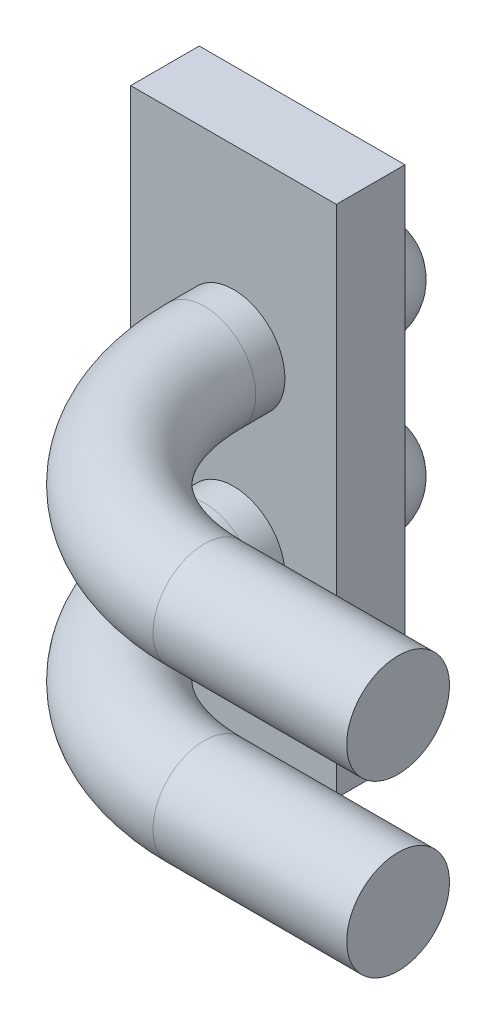
ISO-10303-21;
HEADER;
FILE_DESCRIPTION(('STEP AP214'),'2;1');
FILE_NAME('part.step','',(''),(''),'','','');
FILE_SCHEMA(('AUTOMOTIVE_DESIGN { 1 0 10303 214 1 1 1 1 }'));
ENDSEC;
DATA;
#1=APPLICATION_CONTEXT('core data for automotive mechanical design processes');
#2=APPLICATION_PROTOCOL_DEFINITION('international standard','automotive_design',2000,#1);
#3=PRODUCT_CONTEXT('',#1,'mechanical');
#4=PRODUCT('Part','Part','',(#3));
#5=PRODUCT_RELATED_PRODUCT_CATEGORY('part','',(#4));
#6=PRODUCT_DEFINITION_FORMATION('','',#4);
#7=PRODUCT_DEFINITION_CONTEXT('part definition',#1,'design');
#8=PRODUCT_DEFINITION('design','',#6,#7);
#9=PRODUCT_DEFINITION_SHAPE('','',#8);
#10=(LENGTH_UNIT() NAMED_UNIT(*) SI_UNIT(.MILLI.,.METRE.));
#11=(NAMED_UNIT(*) PLANE_ANGLE_UNIT() SI_UNIT($,.RADIAN.));
#12=(NAMED_UNIT(*) SI_UNIT($,.STERADIAN.) SOLID_ANGLE_UNIT());
#13=UNCERTAINTY_MEASURE_WITH_UNIT(LENGTH_MEASURE(1.E-05),#10,'distance_accuracy_value','');
#14=(GEOMETRIC_REPRESENTATION_CONTEXT(3) GLOBAL_UNCERTAINTY_ASSIGNED_CONTEXT((#13)) GLOBAL_UNIT_ASSIGNED_CONTEXT((#10,
#11,#12)) REPRESENTATION_CONTEXT('',''));
#15=CARTESIAN_POINT('',(0.,0.,0.));
#16=DIRECTION('',(0.,0.,1.));
#17=DIRECTION('',(1.,0.,0.));
#18=AXIS2_PLACEMENT_3D('',#15,#16,#17);
#19=CARTESIAN_POINT('',(3.00000000000001,7.5,2.));
#20=DIRECTION('',(0.,0.,-1.));
#21=DIRECTION('',(-1.,0.,0.));
#22=AXIS2_PLACEMENT_3D('',#19,#20,#21);
#23=PLANE('',#22);
#24=CARTESIAN_POINT('',(0.,-2.62,2.));
#25=DIRECTION('',(0.,0.,1.));
#26=DIRECTION('',(1.,0.,0.));
#27=AXIS2_PLACEMENT_3D('',#24,#25,#26);
#28=CIRCLE('',#27,1.5);
#29=CARTESIAN_POINT('',(1.5,-2.62,2.));
#30=VERTEX_POINT('',#29);
#31=EDGE_CURVE('E42',#30,#30,#28,.T.);
#32=ORIENTED_EDGE('',*,*,#31,.F.);
#33=EDGE_LOOP('',(#32));
#34=FACE_BOUND('',#33,.T.);
#35=DIRECTION('',(0.,1.,0.));
#36=VECTOR('',#35,1.);
#37=CARTESIAN_POINT('',(3.00000000000001,-7.5,2.));
#38=LINE('',#37,#36);
#39=CARTESIAN_POINT('',(3.00000000000001,-7.5,2.));
#40=VERTEX_POINT('',#39);
#41=CARTESIAN_POINT('',(3.00000000000001,7.5,2.));
#42=VERTEX_POINT('',#41);
#43=EDGE_CURVE('E87',#40,#42,#38,.T.);
#44=ORIENTED_EDGE('',*,*,#43,.T.);
#45=DIRECTION('',(-1.,0.,0.));
#46=VECTOR('',#45,1.);
#47=CARTESIAN_POINT('',(-3.,7.5,2.));
#48=LINE('',#47,#46);
#49=CARTESIAN_POINT('',(-3.,7.5,2.));
#50=VERTEX_POINT('',#49);
#51=EDGE_CURVE('E82',#42,#50,#48,.T.);
#52=ORIENTED_EDGE('',*,*,#51,.T.);
#53=DIRECTION('',(0.,-1.,0.));
#54=VECTOR('',#53,1.);
#55=CARTESIAN_POINT('',(-3.,-7.5,2.));
#56=LINE('',#55,#54);
#57=CARTESIAN_POINT('',(-3.,-7.5,2.));
#58=VERTEX_POINT('',#57);
#59=EDGE_CURVE('E85',#50,#58,#56,.T.);
#60=ORIENTED_EDGE('',*,*,#59,.T.);
#61=DIRECTION('',(1.,0.,0.));
#62=VECTOR('',#61,1.);
#63=CARTESIAN_POINT('',(-3.,-7.5,2.));
#64=LINE('',#63,#62);
#65=EDGE_CURVE('E51',#58,#40,#64,.T.);
#66=ORIENTED_EDGE('',*,*,#65,.T.);
#67=EDGE_LOOP('',(#44,#52,#60,#66));
#68=FACE_BOUND('',#67,.T.);
#69=CARTESIAN_POINT('',(0.,2.35,2.));
#70=DIRECTION('',(0.,0.,1.));
#71=DIRECTION('',(1.,0.,0.));
#72=AXIS2_PLACEMENT_3D('',#69,#70,#71);
#73=CIRCLE('',#72,1.5);
#74=CARTESIAN_POINT('',(1.5,2.35,2.));
#75=VERTEX_POINT('',#74);
#76=EDGE_CURVE('E11',#75,#75,#73,.T.);
#77=ORIENTED_EDGE('',*,*,#76,.F.);
#78=EDGE_LOOP('',(#77));
#79=FACE_BOUND('',#78,.T.);
#80=ADVANCED_FACE('F32',(#34,#68,#79),#23,.F.);
#81=CARTESIAN_POINT('',(3.00000000000001,7.5,0.));
#82=DIRECTION('',(0.,0.,-1.));
#83=DIRECTION('',(-1.,0.,0.));
#84=AXIS2_PLACEMENT_3D('',#81,#82,#83);
#85=PLANE('',#84);
#86=CARTESIAN_POINT('',(0.,2.35,0.));
#87=DIRECTION('',(0.,0.,-1.));
#88=DIRECTION('',(-1.,0.,0.));
#89=AXIS2_PLACEMENT_3D('',#86,#87,#88);
#90=CIRCLE('',#89,1.5);
#91=CARTESIAN_POINT('',(-1.5,2.35,0.));
#92=VERTEX_POINT('',#91);
#93=EDGE_CURVE('E105',#92,#92,#90,.T.);
#94=ORIENTED_EDGE('',*,*,#93,.F.);
#95=EDGE_LOOP('',(#94));
#96=FACE_BOUND('',#95,.T.);
#97=DIRECTION('',(0.,1.,0.));
#98=VECTOR('',#97,1.);
#99=CARTESIAN_POINT('',(3.00000000000001,-7.5,0.));
#100=LINE('',#99,#98);
#101=CARTESIAN_POINT('',(3.00000000000001,-7.5,0.));
#102=VERTEX_POINT('',#101);
#103=CARTESIAN_POINT('',(3.00000000000001,7.5,0.));
#104=VERTEX_POINT('',#103);
#105=EDGE_CURVE('E102',#102,#104,#100,.T.);
#106=ORIENTED_EDGE('',*,*,#105,.F.);
#107=DIRECTION('',(1.,0.,0.));
#108=VECTOR('',#107,1.);
#109=CARTESIAN_POINT('',(-3.,-7.5,0.));
#110=LINE('',#109,#108);
#111=CARTESIAN_POINT('',(-3.,-7.5,0.));
#112=VERTEX_POINT('',#111);
#113=EDGE_CURVE('E74',#112,#102,#110,.T.);
#114=ORIENTED_EDGE('',*,*,#113,.F.);
#115=DIRECTION('',(0.,-1.,0.));
#116=VECTOR('',#115,1.);
#117=CARTESIAN_POINT('',(-3.,-7.5,0.));
#118=LINE('',#117,#116);
#119=CARTESIAN_POINT('',(-3.,7.5,0.));
#120=VERTEX_POINT('',#119);
#121=EDGE_CURVE('E68',#120,#112,#118,.T.);
#122=ORIENTED_EDGE('',*,*,#121,.F.);
#123=DIRECTION('',(-1.,0.,0.));
#124=VECTOR('',#123,1.);
#125=CARTESIAN_POINT('',(-3.,7.5,0.));
#126=LINE('',#125,#124);
#127=EDGE_CURVE('E92',#104,#120,#126,.T.);
#128=ORIENTED_EDGE('',*,*,#127,.F.);
#129=EDGE_LOOP('',(#106,#114,#122,#128));
#130=FACE_BOUND('',#129,.T.);
#131=CARTESIAN_POINT('',(0.,-2.62,0.));
#132=DIRECTION('',(0.,0.,-1.));
#133=DIRECTION('',(-1.,0.,0.));
#134=AXIS2_PLACEMENT_3D('',#131,#132,#133);
#135=CIRCLE('',#134,1.5);
#136=CARTESIAN_POINT('',(-1.5,-2.62,0.));
#137=VERTEX_POINT('',#136);
#138=EDGE_CURVE('E132',#137,#137,#135,.T.);
#139=ORIENTED_EDGE('',*,*,#138,.F.);
#140=EDGE_LOOP('',(#139));
#141=FACE_BOUND('',#140,.T.);
#142=ADVANCED_FACE('F140',(#96,#130,#141),#85,.T.);
#143=CARTESIAN_POINT('',(3.00000000000001,-7.5,2.));
#144=DIRECTION('',(-1.,0.,0.));
#145=DIRECTION('',(0.,0.,1.));
#146=AXIS2_PLACEMENT_3D('',#143,#144,#145);
#147=PLANE('',#146);
#148=ORIENTED_EDGE('',*,*,#105,.T.);
#149=DIRECTION('',(0.,0.,-1.));
#150=VECTOR('',#149,1.);
#151=CARTESIAN_POINT('',(3.00000000000001,7.5,2.));
#152=LINE('',#151,#150);
#153=EDGE_CURVE('E93',#42,#104,#152,.T.);
#154=ORIENTED_EDGE('',*,*,#153,.F.);
#155=ORIENTED_EDGE('',*,*,#43,.F.);
#156=DIRECTION('',(0.,0.,-1.));
#157=VECTOR('',#156,1.);
#158=CARTESIAN_POINT('',(3.00000000000001,-7.5,2.));
#159=LINE('',#158,#157);
#160=EDGE_CURVE('E98',#40,#102,#159,.T.);
#161=ORIENTED_EDGE('',*,*,#160,.T.);
#162=EDGE_LOOP('',(#148,#154,#155,#161));
#163=FACE_BOUND('',#162,.T.);
#164=ADVANCED_FACE('F143',(#163),#147,.F.);
#165=CARTESIAN_POINT('',(-3.,7.5,2.));
#166=DIRECTION('',(0.,-1.,0.));
#167=DIRECTION('',(0.,0.,-1.));
#168=AXIS2_PLACEMENT_3D('',#165,#166,#167);
#169=PLANE('',#168);
#170=ORIENTED_EDGE('',*,*,#127,.T.);
#171=DIRECTION('',(0.,0.,-1.));
#172=VECTOR('',#171,1.);
#173=CARTESIAN_POINT('',(-3.,7.5,2.));
#174=LINE('',#173,#172);
#175=EDGE_CURVE('E90',#50,#120,#174,.T.);
#176=ORIENTED_EDGE('',*,*,#175,.F.);
#177=ORIENTED_EDGE('',*,*,#51,.F.);
#178=ORIENTED_EDGE('',*,*,#153,.T.);
#179=EDGE_LOOP('',(#170,#176,#177,#178));
#180=FACE_BOUND('',#179,.T.);
#181=ADVANCED_FACE('F91',(#180),#169,.F.);
#182=CARTESIAN_POINT('',(-3.,-7.5,2.));
#183=DIRECTION('',(1.,0.,0.));
#184=DIRECTION('',(0.,0.,-1.));
#185=AXIS2_PLACEMENT_3D('',#182,#183,#184);
#186=PLANE('',#185);
#187=ORIENTED_EDGE('',*,*,#121,.T.);
#188=DIRECTION('',(0.,0.,-1.));
#189=VECTOR('',#188,1.);
#190=CARTESIAN_POINT('',(-3.,-7.5,2.));
#191=LINE('',#190,#189);
#192=EDGE_CURVE('E94',#58,#112,#191,.T.);
#193=ORIENTED_EDGE('',*,*,#192,.F.);
#194=ORIENTED_EDGE('',*,*,#59,.F.);
#195=ORIENTED_EDGE('',*,*,#175,.T.);
#196=EDGE_LOOP('',(#187,#193,#194,#195));
#197=FACE_BOUND('',#196,.T.);
#198=ADVANCED_FACE('F96',(#197),#186,.F.);
#199=CARTESIAN_POINT('',(-3.,-7.5,2.));
#200=DIRECTION('',(0.,1.,0.));
#201=DIRECTION('',(0.,0.,1.));
#202=AXIS2_PLACEMENT_3D('',#199,#200,#201);
#203=PLANE('',#202);
#204=ORIENTED_EDGE('',*,*,#113,.T.);
#205=ORIENTED_EDGE('',*,*,#160,.F.);
#206=ORIENTED_EDGE('',*,*,#65,.F.);
#207=ORIENTED_EDGE('',*,*,#192,.T.);
#208=EDGE_LOOP('',(#204,#205,#206,#207));
#209=FACE_BOUND('',#208,.T.);
#210=ADVANCED_FACE('F158',(#209),#203,.F.);
#211=CARTESIAN_POINT('',(0.,2.35,-3.));
#212=DIRECTION('',(0.,0.,1.));
#213=DIRECTION('',(1.,0.,0.));
#214=AXIS2_PLACEMENT_3D('',#211,#212,#213);
#215=CYLINDRICAL_SURFACE('',#214,1.5);
#216=CARTESIAN_POINT('',(0.,2.35,-1.5));
#217=DIRECTION('',(0.,0.,1.));
#218=DIRECTION('',(1.,0.,0.));
#219=AXIS2_PLACEMENT_3D('',#216,#217,#218);
#220=CIRCLE('',#219,1.5);
#221=CARTESIAN_POINT('',(1.5,2.35,-1.5));
#222=VERTEX_POINT('',#221);
#223=EDGE_CURVE('E36',#222,#222,#220,.T.);
#224=ORIENTED_EDGE('',*,*,#223,.T.);
#225=EDGE_LOOP('',(#224));
#226=FACE_BOUND('',#225,.T.);
#227=ORIENTED_EDGE('',*,*,#93,.T.);
#228=EDGE_LOOP('',(#227));
#229=FACE_BOUND('',#228,.T.);
#230=ADVANCED_FACE('F138',(#226,#229),#215,.T.);
#231=CARTESIAN_POINT('',(0.,-2.62,-3.));
#232=DIRECTION('',(0.,0.,1.));
#233=DIRECTION('',(1.,0.,0.));
#234=AXIS2_PLACEMENT_3D('',#231,#232,#233);
#235=CYLINDRICAL_SURFACE('',#234,1.5);
#236=CARTESIAN_POINT('',(0.,-2.62,-1.5));
#237=DIRECTION('',(0.,0.,1.));
#238=DIRECTION('',(1.,0.,0.));
#239=AXIS2_PLACEMENT_3D('',#236,#237,#238);
#240=CIRCLE('',#239,1.5);
#241=CARTESIAN_POINT('',(1.5,-2.62,-1.5));
#242=VERTEX_POINT('',#241);
#243=EDGE_CURVE('E111',#242,#242,#240,.T.);
#244=ORIENTED_EDGE('',*,*,#243,.T.);
#245=EDGE_LOOP('',(#244));
#246=FACE_BOUND('',#245,.T.);
#247=ORIENTED_EDGE('',*,*,#138,.T.);
#248=EDGE_LOOP('',(#247));
#249=FACE_BOUND('',#248,.T.);
#250=ADVANCED_FACE('F149',(#246,#249),#235,.T.);
#251=CARTESIAN_POINT('',(0.,-2.62,-1.5));
#252=DIRECTION('',(0.,0.,1.));
#253=DIRECTION('',(1.,0.,0.));
#254=AXIS2_PLACEMENT_3D('',#251,#252,#253);
#255=SPHERICAL_SURFACE('',#254,1.5);
#256=ORIENTED_EDGE('',*,*,#243,.F.);
#257=EDGE_LOOP('',(#256));
#258=FACE_BOUND('',#257,.T.);
#259=ADVANCED_FACE('F151',(#258),#255,.T.);
#260=CARTESIAN_POINT('',(0.,2.35,-1.5));
#261=DIRECTION('',(0.,0.,1.));
#262=DIRECTION('',(1.,0.,0.));
#263=AXIS2_PLACEMENT_3D('',#260,#261,#262);
#264=SPHERICAL_SURFACE('',#263,1.5);
#265=ORIENTED_EDGE('',*,*,#223,.F.);
#266=EDGE_LOOP('',(#265));
#267=FACE_BOUND('',#266,.T.);
#268=ADVANCED_FACE('F34',(#267),#264,.T.);
#269=CARTESIAN_POINT('',(6.,-2.62,8.85));
#270=DIRECTION('',(1.,0.,0.));
#271=DIRECTION('',(0.,0.,-1.));
#272=AXIS2_PLACEMENT_3D('',#269,#270,#271);
#273=CYLINDRICAL_SURFACE('',#272,1.5);
#274=CARTESIAN_POINT('',(6.,-2.62,8.85));
#275=DIRECTION('',(1.,0.,0.));
#276=DIRECTION('',(0.,0.,-1.));
#277=AXIS2_PLACEMENT_3D('',#274,#275,#276);
#278=CIRCLE('',#277,1.5);
#279=CARTESIAN_POINT('',(6.,-2.62,10.35));
#280=VERTEX_POINT('',#279);
#281=EDGE_CURVE('E126',#280,#280,#278,.T.);
#282=ORIENTED_EDGE('',*,*,#281,.T.);
#283=EDGE_LOOP('',(#282));
#284=FACE_BOUND('',#283,.T.);
#285=CARTESIAN_POINT('',(11.65,-2.62,8.85));
#286=DIRECTION('',(1.,0.,0.));
#287=DIRECTION('',(0.,0.,-1.));
#288=AXIS2_PLACEMENT_3D('',#285,#286,#287);
#289=CIRCLE('',#288,1.5);
#290=CARTESIAN_POINT('',(11.65,-2.62,7.35));
#291=VERTEX_POINT('',#290);
#292=EDGE_CURVE('E129',#291,#291,#289,.T.);
#293=ORIENTED_EDGE('',*,*,#292,.F.);
#294=EDGE_LOOP('',(#293));
#295=FACE_BOUND('',#294,.T.);
#296=ADVANCED_FACE('F215',(#284,#295),#273,.T.);
#297=CARTESIAN_POINT('',(6.,-2.62,2.85));
#298=DIRECTION('',(0.,1.,0.));
#299=DIRECTION('',(0.,0.,1.));
#300=AXIS2_PLACEMENT_3D('',#297,#298,#299);
#301=TOROIDAL_SURFACE('',#300,6.,1.5);
#302=CARTESIAN_POINT('',(0.,-2.62,2.85));
#303=DIRECTION('',(0.,0.,1.));
#304=DIRECTION('',(1.,0.,0.));
#305=AXIS2_PLACEMENT_3D('',#302,#303,#304);
#306=CIRCLE('',#305,1.5);
#307=CARTESIAN_POINT('',(-1.5,-2.62,2.85));
#308=VERTEX_POINT('',#307);
#309=EDGE_CURVE('E124',#308,#308,#306,.T.);
#310=CARTESIAN_POINT('',(6.,-2.62,2.85));
#311=DIRECTION('',(0.,1.,0.));
#312=DIRECTION('',(0.,0.,1.));
#313=AXIS2_PLACEMENT_3D('',#310,#311,#312);
#314=CIRCLE('',#313,7.5);
#315=EDGE_CURVE('',#308,#280,#314,.T.);
#316=ORIENTED_EDGE('',*,*,#309,.T.);
#317=ORIENTED_EDGE('',*,*,#281,.F.);
#318=ORIENTED_EDGE('',*,*,#315,.T.);
#319=ORIENTED_EDGE('',*,*,#315,.F.);
#320=EDGE_LOOP('',(#316,#318,#317,#319));
#321=FACE_BOUND('',#320,.T.);
#322=ADVANCED_FACE('F229',(#321),#301,.T.);
#323=CARTESIAN_POINT('',(0.,-2.62,2.85));
#324=DIRECTION('',(0.,0.,-1.));
#325=DIRECTION('',(-1.,0.,0.));
#326=AXIS2_PLACEMENT_3D('',#323,#324,#325);
#327=CYLINDRICAL_SURFACE('',#326,1.5);
#328=ORIENTED_EDGE('',*,*,#309,.F.);
#329=EDGE_LOOP('',(#328));
#330=FACE_BOUND('',#329,.T.);
#331=ORIENTED_EDGE('',*,*,#31,.T.);
#332=EDGE_LOOP('',(#331));
#333=FACE_BOUND('',#332,.T.);
#334=ADVANCED_FACE('F238',(#330,#333),#327,.T.);
#335=CARTESIAN_POINT('',(11.65,-2.62,8.85));
#336=DIRECTION('',(1.,0.,0.));
#337=DIRECTION('',(0.,0.,-1.));
#338=AXIS2_PLACEMENT_3D('',#335,#336,#337);
#339=PLANE('',#338);
#340=ORIENTED_EDGE('',*,*,#292,.T.);
#341=EDGE_LOOP('',(#340));
#342=FACE_BOUND('',#341,.T.);
#343=ADVANCED_FACE('F248',(#342),#339,.T.);
#344=CARTESIAN_POINT('',(6.,2.35,8.85));
#345=DIRECTION('',(1.,0.,0.));
#346=DIRECTION('',(0.,0.,-1.));
#347=AXIS2_PLACEMENT_3D('',#344,#345,#346);
#348=CYLINDRICAL_SURFACE('',#347,1.5);
#349=CARTESIAN_POINT('',(6.,2.35,8.85));
#350=DIRECTION('',(1.,0.,0.));
#351=DIRECTION('',(0.,0.,-1.));
#352=AXIS2_PLACEMENT_3D('',#349,#350,#351);
#353=CIRCLE('',#352,1.5);
#354=CARTESIAN_POINT('',(6.,2.35,10.35));
#355=VERTEX_POINT('',#354);
#356=EDGE_CURVE('E306',#355,#355,#353,.T.);
#357=ORIENTED_EDGE('',*,*,#356,.T.);
#358=EDGE_LOOP('',(#357));
#359=FACE_BOUND('',#358,.T.);
#360=CARTESIAN_POINT('',(11.65,2.35,8.85));
#361=DIRECTION('',(1.,0.,0.));
#362=DIRECTION('',(0.,0.,-1.));
#363=AXIS2_PLACEMENT_3D('',#360,#361,#362);
#364=CIRCLE('',#363,1.5);
#365=CARTESIAN_POINT('',(11.65,2.35,7.35));
#366=VERTEX_POINT('',#365);
#367=EDGE_CURVE('E304',#366,#366,#364,.T.);
#368=ORIENTED_EDGE('',*,*,#367,.F.);
#369=EDGE_LOOP('',(#368));
#370=FACE_BOUND('',#369,.T.);
#371=ADVANCED_FACE('F258',(#359,#370),#348,.T.);
#372=CARTESIAN_POINT('',(6.,2.35,2.85));
#373=DIRECTION('',(0.,1.,0.));
#374=DIRECTION('',(0.,0.,1.));
#375=AXIS2_PLACEMENT_3D('',#372,#373,#374);
#376=TOROIDAL_SURFACE('',#375,6.,1.5);
#377=CARTESIAN_POINT('',(0.,2.35,2.85));
#378=DIRECTION('',(0.,0.,1.));
#379=DIRECTION('',(1.,0.,0.));
#380=AXIS2_PLACEMENT_3D('',#377,#378,#379);
#381=CIRCLE('',#380,1.5);
#382=CARTESIAN_POINT('',(-1.5,2.35,2.85));
#383=VERTEX_POINT('',#382);
#384=EDGE_CURVE('E309',#383,#383,#381,.T.);
#385=CARTESIAN_POINT('',(6.,2.35,2.85));
#386=DIRECTION('',(0.,1.,0.));
#387=DIRECTION('',(0.,0.,1.));
#388=AXIS2_PLACEMENT_3D('',#385,#386,#387);
#389=CIRCLE('',#388,7.5);
#390=EDGE_CURVE('',#383,#355,#389,.T.);
#391=ORIENTED_EDGE('',*,*,#384,.T.);
#392=ORIENTED_EDGE('',*,*,#356,.F.);
#393=ORIENTED_EDGE('',*,*,#390,.T.);
#394=ORIENTED_EDGE('',*,*,#390,.F.);
#395=EDGE_LOOP('',(#391,#393,#392,#394));
#396=FACE_BOUND('',#395,.T.);
#397=ADVANCED_FACE('F268',(#396),#376,.T.);
#398=CARTESIAN_POINT('',(0.,2.35,2.85));
#399=DIRECTION('',(0.,0.,-1.));
#400=DIRECTION('',(-1.,0.,0.));
#401=AXIS2_PLACEMENT_3D('',#398,#399,#400);
#402=CYLINDRICAL_SURFACE('',#401,1.5);
#403=ORIENTED_EDGE('',*,*,#384,.F.);
#404=EDGE_LOOP('',(#403));
#405=FACE_BOUND('',#404,.T.);
#406=ORIENTED_EDGE('',*,*,#76,.T.);
#407=EDGE_LOOP('',(#406));
#408=FACE_BOUND('',#407,.T.);
#409=ADVANCED_FACE('F278',(#405,#408),#402,.T.);
#410=CARTESIAN_POINT('',(11.65,2.35,8.85));
#411=DIRECTION('',(1.,0.,0.));
#412=DIRECTION('',(0.,0.,-1.));
#413=AXIS2_PLACEMENT_3D('',#410,#411,#412);
#414=PLANE('',#413);
#415=ORIENTED_EDGE('',*,*,#367,.T.);
#416=EDGE_LOOP('',(#415));
#417=FACE_BOUND('',#416,.T.);
#418=ADVANCED_FACE('F288',(#417),#414,.T.);
#419=CLOSED_SHELL('',(#80,#142,#164,#181,#198,#210,#230,#250,#259,#268,#296,#322,#334,#343,#371,
#397,#409,#418));
#420=MANIFOLD_SOLID_BREP('B2',#419);
#421=ADVANCED_BREP_SHAPE_REPRESENTATION('',(#18,#420),#14);
#422=SHAPE_DEFINITION_REPRESENTATION(#9,#421);
ENDSEC;
END-ISO-10303-21;
